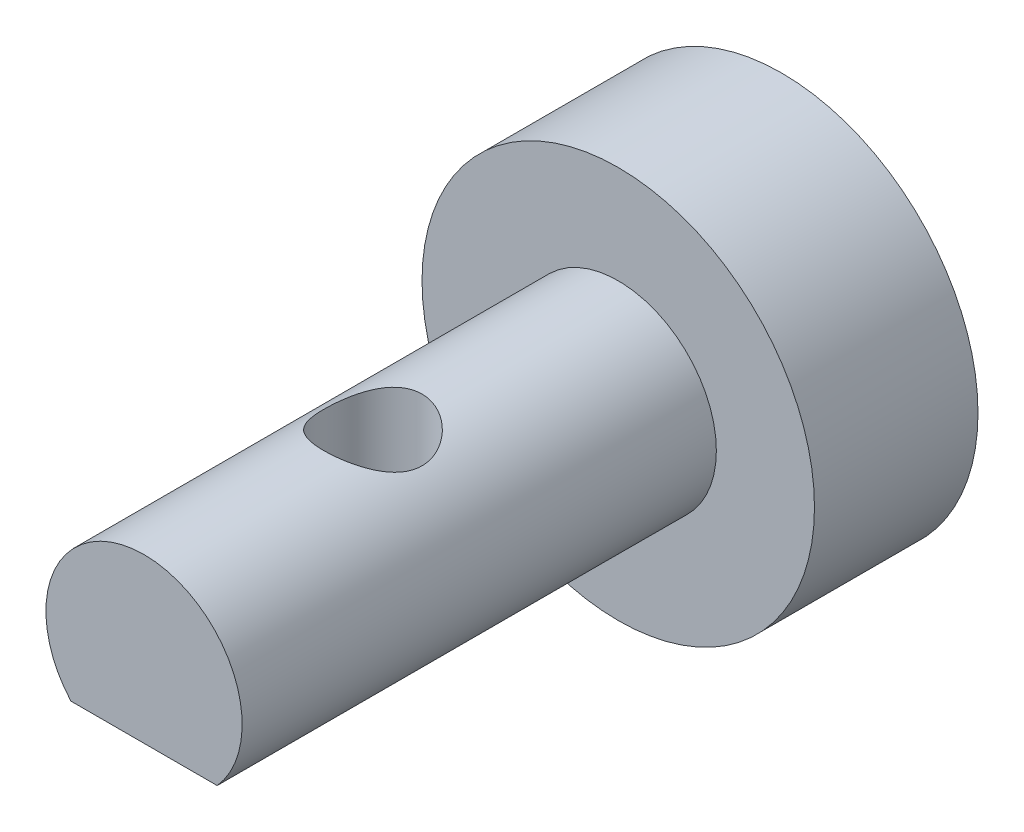
ISO-10303-21;
HEADER;
FILE_DESCRIPTION(('STEP AP214'),'2;1');
FILE_NAME('part.step','',(''),(''),'','','');
FILE_SCHEMA(('AUTOMOTIVE_DESIGN { 1 0 10303 214 1 1 1 1 }'));
ENDSEC;
DATA;
#1=APPLICATION_CONTEXT('core data for automotive mechanical design processes');
#2=APPLICATION_PROTOCOL_DEFINITION('international standard','automotive_design',2000,#1);
#3=PRODUCT_CONTEXT('',#1,'mechanical');
#4=PRODUCT('Part','Part','',(#3));
#5=PRODUCT_RELATED_PRODUCT_CATEGORY('part','',(#4));
#6=PRODUCT_DEFINITION_FORMATION('','',#4);
#7=PRODUCT_DEFINITION_CONTEXT('part definition',#1,'design');
#8=PRODUCT_DEFINITION('design','',#6,#7);
#9=PRODUCT_DEFINITION_SHAPE('','',#8);
#10=(LENGTH_UNIT() NAMED_UNIT(*) SI_UNIT(.MILLI.,.METRE.));
#11=(NAMED_UNIT(*) PLANE_ANGLE_UNIT() SI_UNIT($,.RADIAN.));
#12=(NAMED_UNIT(*) SI_UNIT($,.STERADIAN.) SOLID_ANGLE_UNIT());
#13=UNCERTAINTY_MEASURE_WITH_UNIT(LENGTH_MEASURE(1.E-05),#10,'distance_accuracy_value','');
#14=(GEOMETRIC_REPRESENTATION_CONTEXT(3) GLOBAL_UNCERTAINTY_ASSIGNED_CONTEXT((#13)) GLOBAL_UNIT_ASSIGNED_CONTEXT((#10,
#11,#12)) REPRESENTATION_CONTEXT('',''));
#15=CARTESIAN_POINT('',(0.,0.,0.));
#16=DIRECTION('',(0.,0.,1.));
#17=DIRECTION('',(1.,0.,0.));
#18=AXIS2_PLACEMENT_3D('',#15,#16,#17);
#19=CARTESIAN_POINT('',(0.,0.,5.));
#20=DIRECTION('',(0.,0.,-1.));
#21=DIRECTION('',(-1.,0.,0.));
#22=AXIS2_PLACEMENT_3D('',#19,#20,#21);
#23=CYLINDRICAL_SURFACE('',#22,6.);
#24=CARTESIAN_POINT('',(0.,0.,5.));
#25=DIRECTION('',(0.,0.,1.));
#26=DIRECTION('',(1.,0.,0.));
#27=AXIS2_PLACEMENT_3D('',#24,#25,#26);
#28=CIRCLE('',#27,6.);
#29=CARTESIAN_POINT('',(6.,0.,5.));
#30=VERTEX_POINT('',#29);
#31=EDGE_CURVE('E52',#30,#30,#28,.T.);
#32=ORIENTED_EDGE('',*,*,#31,.F.);
#33=EDGE_LOOP('',(#32));
#34=FACE_BOUND('',#33,.T.);
#35=CARTESIAN_POINT('',(0.,0.,0.));
#36=DIRECTION('',(0.,0.,1.));
#37=DIRECTION('',(1.,0.,0.));
#38=AXIS2_PLACEMENT_3D('',#35,#36,#37);
#39=CIRCLE('',#38,6.);
#40=CARTESIAN_POINT('',(6.,0.,0.));
#41=VERTEX_POINT('',#40);
#42=EDGE_CURVE('E47',#41,#41,#39,.T.);
#43=ORIENTED_EDGE('',*,*,#42,.T.);
#44=EDGE_LOOP('',(#43));
#45=FACE_BOUND('',#44,.T.);
#46=ADVANCED_FACE('F44',(#34,#45),#23,.T.);
#47=CARTESIAN_POINT('',(0.,0.,5.));
#48=DIRECTION('',(0.,0.,1.));
#49=DIRECTION('',(1.,0.,0.));
#50=AXIS2_PLACEMENT_3D('',#47,#48,#49);
#51=PLANE('',#50);
#52=CARTESIAN_POINT('',(0.,0.,5.));
#53=DIRECTION('',(0.,0.,1.));
#54=DIRECTION('',(1.,0.,0.));
#55=AXIS2_PLACEMENT_3D('',#52,#53,#54);
#56=CIRCLE('',#55,3.);
#57=CARTESIAN_POINT('',(3.,0.,5.));
#58=VERTEX_POINT('',#57);
#59=EDGE_CURVE('E13',#58,#58,#56,.T.);
#60=ORIENTED_EDGE('',*,*,#59,.F.);
#61=EDGE_LOOP('',(#60));
#62=FACE_BOUND('',#61,.T.);
#63=ORIENTED_EDGE('',*,*,#31,.T.);
#64=EDGE_LOOP('',(#63));
#65=FACE_BOUND('',#64,.T.);
#66=ADVANCED_FACE('F100',(#62,#65),#51,.T.);
#67=CARTESIAN_POINT('',(0.,0.,0.));
#68=DIRECTION('',(0.,0.,1.));
#69=DIRECTION('',(1.,0.,0.));
#70=AXIS2_PLACEMENT_3D('',#67,#68,#69);
#71=PLANE('',#70);
#72=ORIENTED_EDGE('',*,*,#42,.F.);
#73=EDGE_LOOP('',(#72));
#74=FACE_BOUND('',#73,.T.);
#75=ADVANCED_FACE('F98',(#74),#71,.F.);
#76=CARTESIAN_POINT('',(0.,0.,7.5));
#77=DIRECTION('',(0.,0.,-1.));
#78=DIRECTION('',(-1.,0.,0.));
#79=AXIS2_PLACEMENT_3D('',#76,#77,#78);
#80=CYLINDRICAL_SURFACE('',#79,3.);
#81=CARTESIAN_POINT('',(0.,3.,11.));
#82=CARTESIAN_POINT('',(-0.0788579444268493,2.99999570107562,11.0000049534758));
#83=CARTESIAN_POINT('',(-0.157809899546343,2.99685736529635,11.0062551096816));
#84=CARTESIAN_POINT('',(-0.313380352903343,2.98461234055736,11.0309793205123));
#85=CARTESIAN_POINT('',(-0.389994130070444,2.97549431743379,11.0494765894967));
#86=CARTESIAN_POINT('',(-0.538400317320673,2.95224419105063,11.0977907129249));
#87=CARTESIAN_POINT('',(-0.610210204408719,2.93813158766306,11.127563576372));
#88=CARTESIAN_POINT('',(-0.747708925209897,2.90618664773642,11.1973559320475));
#89=CARTESIAN_POINT('',(-0.813398240985088,2.88835460450288,11.2373746163733));
#90=CARTESIAN_POINT('',(-0.941261726642864,2.84934387387093,11.3292758742279));
#91=CARTESIAN_POINT('',(-1.00298281668316,2.82802798691306,11.3817297188595));
#92=CARTESIAN_POINT('',(-1.11716916730047,2.78489955370115,11.4957822188706));
#93=CARTESIAN_POINT('',(-1.16962737466015,2.76308664313552,11.5573877776587));
#94=CARTESIAN_POINT('',(-1.26787800067542,2.71948426796021,11.6937250242851));
#95=CARTESIAN_POINT('',(-1.31283800332745,2.69782780455198,11.7691041475189));
#96=CARTESIAN_POINT('',(-1.38925234033604,2.65928968158481,11.9275510039793));
#97=CARTESIAN_POINT('',(-1.4207163224495,2.64240461410484,12.0106131930841));
#98=CARTESIAN_POINT('',(-1.46719866328288,2.61686800556713,12.1769976581329));
#99=CARTESIAN_POINT('',(-1.48308878562066,2.6077840737557,12.2600066781011));
#100=CARTESIAN_POINT('',(-1.50064048996327,2.59772834922792,12.4279682566692));
#101=CARTESIAN_POINT('',(-1.50231613255961,2.59674854014932,12.5129188113067));
#102=CARTESIAN_POINT('',(-1.49203093075844,2.60266395385873,12.6714290364731));
#103=CARTESIAN_POINT('',(-1.48167683930523,2.6086314549302,12.7451360468346));
#104=CARTESIAN_POINT('',(-1.4504097735854,2.62614343100776,12.8895828640596));
#105=CARTESIAN_POINT('',(-1.42949343584648,2.63768968247664,12.960321717958));
#106=CARTESIAN_POINT('',(-1.37731467057901,2.66531214619112,13.0988436988485));
#107=CARTESIAN_POINT('',(-1.34582260067399,2.68148760995998,13.1665195981787));
#108=CARTESIAN_POINT('',(-1.273562531502,2.71655106422106,13.295951438885));
#109=CARTESIAN_POINT('',(-1.2327903657187,2.73544027170286,13.3577047034001));
#110=CARTESIAN_POINT('',(-1.13709908236918,2.77669736854929,13.4817818791148));
#111=CARTESIAN_POINT('',(-1.08104168755392,2.79920265355119,13.5431853103642));
#112=CARTESIAN_POINT('',(-0.95933336811206,2.84321434950611,13.6561031278864));
#113=CARTESIAN_POINT('',(-0.893677884861428,2.86472027938201,13.7076127880508));
#114=CARTESIAN_POINT('',(-0.750774758747773,2.90552980924446,13.8015284915446));
#115=CARTESIAN_POINT('',(-0.673130387399114,2.92468476243011,13.8434007086686));
#116=CARTESIAN_POINT('',(-0.510699323233195,2.95736821681863,13.9131455435645));
#117=CARTESIAN_POINT('',(-0.425918364397913,2.9709011841533,13.9410292775228));
#118=CARTESIAN_POINT('',(-0.259149737491052,2.98986500612153,13.979713105575));
#119=CARTESIAN_POINT('',(-0.177512295822488,2.99587407451965,13.9917368536202));
#120=CARTESIAN_POINT('',(-0.0131693999240266,3.00109520188655,14.0021970967017));
#121=CARTESIAN_POINT('',(0.0695355298048639,3.00031048081978,14.0006400284592));
#122=CARTESIAN_POINT('',(0.226849457978981,2.99236788380152,13.9846899673719));
#123=CARTESIAN_POINT('',(0.301589112074896,2.98570868532252,13.971301200905));
#124=CARTESIAN_POINT('',(0.447610338452912,2.9673325697226,13.9336428921573));
#125=CARTESIAN_POINT('',(0.518891528536631,2.95561509501618,13.9093721503198));
#126=CARTESIAN_POINT('',(0.65833291267436,2.92776377120382,13.8500023003505));
#127=CARTESIAN_POINT('',(0.726345595508706,2.91151322654446,13.8146134248256));
#128=CARTESIAN_POINT('',(0.855692042548908,2.87615961476126,13.7343386965302));
#129=CARTESIAN_POINT('',(0.917022944664888,2.85705533350407,13.6894487981069));
#130=CARTESIAN_POINT('',(1.03765153393382,2.81562332004297,13.5863593620039));
#131=CARTESIAN_POINT('',(1.09615811672854,2.79316327265249,13.5272856973323));
#132=CARTESIAN_POINT('',(1.20278448167828,2.7489358741323,13.4001122730834));
#133=CARTESIAN_POINT('',(1.25089707856781,2.72716901100071,13.3320063217281));
#134=CARTESIAN_POINT('',(1.33756187171853,2.68576788309734,13.1845345187405));
#135=CARTESIAN_POINT('',(1.37553824370037,2.66628794383591,13.1047831008583));
#136=CARTESIAN_POINT('',(1.43712423890206,2.63361108441202,12.9387348986376));
#137=CARTESIAN_POINT('',(1.46075237380053,2.62040607332625,12.8524467102997));
#138=CARTESIAN_POINT('',(1.49079253120031,2.60342251538703,12.6846346656729));
#139=CARTESIAN_POINT('',(1.49863949460818,2.59886075197597,12.6034486198471));
#140=CARTESIAN_POINT('',(1.5010337315643,2.59748031962405,12.4408293992532));
#141=CARTESIAN_POINT('',(1.49558676993486,2.60065829439585,12.3593963468932));
#142=CARTESIAN_POINT('',(1.47288918838997,2.61356793076615,12.2067747476998));
#143=CARTESIAN_POINT('',(1.45681247151455,2.62264641723988,12.1353492947829));
#144=CARTESIAN_POINT('',(1.41476303733662,2.64556524281479,11.9962878208635));
#145=CARTESIAN_POINT('',(1.38878713673988,2.65940711354503,11.928653026862));
#146=CARTESIAN_POINT('',(1.32572361795085,2.69142795546803,11.7940627235202));
#147=CARTESIAN_POINT('',(1.28800670672355,2.70983583593881,11.7274581472565));
#148=CARTESIAN_POINT('',(1.20322645745609,2.7485299745229,11.6010881957281));
#149=CARTESIAN_POINT('',(1.15615825686234,2.76881720693416,11.5413264042183));
#150=CARTESIAN_POINT('',(1.04730498999206,2.81193484737138,11.422787026468));
#151=CARTESIAN_POINT('',(0.984426634495895,2.83477474959942,11.3650113464746));
#152=CARTESIAN_POINT('',(0.849232209349798,2.87816628389896,11.2606055248471));
#153=CARTESIAN_POINT('',(0.776911084957798,2.89871667939293,11.2139813907951));
#154=CARTESIAN_POINT('',(0.623897395174421,2.93547014349806,11.1331454559319));
#155=CARTESIAN_POINT('',(0.543149255665099,2.95164144740899,11.0990237461453));
#156=CARTESIAN_POINT('',(0.376113151707133,2.9775201194848,11.0452877483639));
#157=CARTESIAN_POINT('',(0.289841699383653,2.98724585044602,11.0256322297914));
#158=CARTESIAN_POINT('',(0.168902919736345,2.99543192870217,11.0091538833714));
#159=CARTESIAN_POINT('',(0.135242819162349,2.99714048010376,11.0057260387005));
#160=CARTESIAN_POINT('',(0.0677275977076386,2.99942545465223,11.0011480017289));
#161=CARTESIAN_POINT('',(0.0338724714699437,3.00000184655071,10.9999978722947));
#162=CARTESIAN_POINT('',(0.,3.,11.));
#163=B_SPLINE_CURVE_WITH_KNOTS('',3,(#81,#82,#83,#84,#85,#86,#87,#88,#89,#90,#91,#92,#93,#94,
#95,#96,#97,#98,#99,#100,#101,#102,#103,#104,#105,#106,#107,#108,#109,#110,#111,#112,#113,#114,
#115,#116,#117,#118,#119,#120,#121,#122,#123,#124,#125,#126,#127,#128,#129,#130,#131,#132,#133,
#134,#135,#136,#137,#138,#139,#140,#141,#142,#143,#144,#145,#146,#147,#148,#149,#150,#151,#152,
#153,#154,#155,#156,#157,#158,#159,#160,#161,#162),.UNSPECIFIED.,.T.,.F.,(4,2,2,2,2,2,2,2,2,2,2,
2,2,2,2,2,2,2,2,2,2,2,2,2,2,2,2,2,2,2,2,2,2,2,2,2,2,2,2,2,4),(0.,0.236436386130439,
0.473322224563797,0.709293233238448,0.945245640872352,1.19547263807713,1.44588935648105,
1.71572589646129,1.98536921847421,2.23887018210344,2.49212035993531,2.71508568613981,
2.93812205888517,3.16635360252731,3.39468781890333,3.65197412000818,3.90938301898029,
4.17874533321661,4.44789325368419,4.69474935707018,4.94148846767214,5.16910359759183,
5.39674382446397,5.63089284041848,5.86514176122509,6.12239415966628,6.37982382923148,
6.64972023242588,6.91926767918176,7.1629396125457,7.40650589797017,7.62686895373283,
7.84730293182526,8.08254685170431,8.31791341715446,8.58187864135757,8.84598575071869,
9.1119602049529,9.37717362931724,9.47872920200875,9.58028757766599),.UNSPECIFIED.);
#164=CARTESIAN_POINT('',(0.,3.,11.));
#165=VERTEX_POINT('',#164);
#166=EDGE_CURVE('E84',#165,#165,#163,.T.);
#167=ORIENTED_EDGE('',*,*,#166,.F.);
#168=EDGE_LOOP('',(#167));
#169=FACE_BOUND('',#168,.T.);
#170=CARTESIAN_POINT('',(0.,0.,7.5));
#171=DIRECTION('',(0.,0.,1.));
#172=DIRECTION('',(1.,0.,0.));
#173=AXIS2_PLACEMENT_3D('',#170,#171,#172);
#174=CIRCLE('',#173,3.);
#175=CARTESIAN_POINT('',(-2.23606797749979,-2.,7.5));
#176=VERTEX_POINT('',#175);
#177=CARTESIAN_POINT('',(2.23606797749979,-2.,7.5));
#178=VERTEX_POINT('',#177);
#179=EDGE_CURVE('E71',#176,#178,#174,.T.);
#180=ORIENTED_EDGE('',*,*,#179,.F.);
#181=DIRECTION('',(0.,0.,-1.));
#182=VECTOR('',#181,1.);
#183=CARTESIAN_POINT('',(-2.23606797749979,-2.,19.5));
#184=LINE('',#183,#182);
#185=CARTESIAN_POINT('',(-2.23606797749979,-2.,19.5));
#186=VERTEX_POINT('',#185);
#187=EDGE_CURVE('E77',#186,#176,#184,.T.);
#188=ORIENTED_EDGE('',*,*,#187,.F.);
#189=CARTESIAN_POINT('',(0.,0.,19.5));
#190=DIRECTION('',(0.,0.,1.));
#191=DIRECTION('',(1.,0.,0.));
#192=AXIS2_PLACEMENT_3D('',#189,#190,#191);
#193=CIRCLE('',#192,3.);
#194=CARTESIAN_POINT('',(2.23606797749979,-2.,19.5));
#195=VERTEX_POINT('',#194);
#196=EDGE_CURVE('E83',#195,#186,#193,.T.);
#197=ORIENTED_EDGE('',*,*,#196,.F.);
#198=DIRECTION('',(0.,0.,-1.));
#199=VECTOR('',#198,1.);
#200=CARTESIAN_POINT('',(2.23606797749979,-2.,19.5));
#201=LINE('',#200,#199);
#202=EDGE_CURVE('E81',#195,#178,#201,.T.);
#203=ORIENTED_EDGE('',*,*,#202,.T.);
#204=EDGE_LOOP('',(#180,#188,#197,#203));
#205=FACE_BOUND('',#204,.T.);
#206=ORIENTED_EDGE('',*,*,#59,.T.);
#207=EDGE_LOOP('',(#206));
#208=FACE_BOUND('',#207,.T.);
#209=ADVANCED_FACE('F86',(#169,#205,#208),#80,.T.);
#210=CARTESIAN_POINT('',(0.,0.,7.5));
#211=DIRECTION('',(0.,0.,1.));
#212=DIRECTION('',(1.,0.,0.));
#213=AXIS2_PLACEMENT_3D('',#210,#211,#212);
#214=PLANE('',#213);
#215=DIRECTION('',(1.,0.,0.));
#216=VECTOR('',#215,1.);
#217=CARTESIAN_POINT('',(-2.23606797749979,-2.,7.5));
#218=LINE('',#217,#216);
#219=EDGE_CURVE('E59',#176,#178,#218,.T.);
#220=ORIENTED_EDGE('',*,*,#219,.F.);
#221=ORIENTED_EDGE('',*,*,#179,.T.);
#222=EDGE_LOOP('',(#220,#221));
#223=FACE_BOUND('',#222,.T.);
#224=ADVANCED_FACE('F72',(#223),#214,.T.);
#225=CARTESIAN_POINT('',(-2.23606797749979,-2.,19.5));
#226=DIRECTION('',(0.,1.,0.));
#227=DIRECTION('',(0.,0.,1.));
#228=AXIS2_PLACEMENT_3D('',#225,#226,#227);
#229=PLANE('',#228);
#230=CARTESIAN_POINT('',(0.,-2.,12.5));
#231=DIRECTION('',(0.,-1.,0.));
#232=DIRECTION('',(0.,0.,-1.));
#233=AXIS2_PLACEMENT_3D('',#230,#231,#232);
#234=CIRCLE('',#233,1.5);
#235=CARTESIAN_POINT('',(0.,-2.,11.));
#236=VERTEX_POINT('',#235);
#237=EDGE_CURVE('E178',#236,#236,#234,.T.);
#238=ORIENTED_EDGE('',*,*,#237,.F.);
#239=EDGE_LOOP('',(#238));
#240=FACE_BOUND('',#239,.T.);
#241=ORIENTED_EDGE('',*,*,#219,.T.);
#242=ORIENTED_EDGE('',*,*,#202,.F.);
#243=DIRECTION('',(1.,0.,0.));
#244=VECTOR('',#243,1.);
#245=CARTESIAN_POINT('',(-2.23606797749979,-2.,19.5));
#246=LINE('',#245,#244);
#247=EDGE_CURVE('E67',#186,#195,#246,.T.);
#248=ORIENTED_EDGE('',*,*,#247,.F.);
#249=ORIENTED_EDGE('',*,*,#187,.T.);
#250=EDGE_LOOP('',(#241,#242,#248,#249));
#251=FACE_BOUND('',#250,.T.);
#252=ADVANCED_FACE('F80',(#240,#251),#229,.F.);
#253=CARTESIAN_POINT('',(0.,0.,19.5));
#254=DIRECTION('',(0.,0.,1.));
#255=DIRECTION('',(1.,0.,0.));
#256=AXIS2_PLACEMENT_3D('',#253,#254,#255);
#257=PLANE('',#256);
#258=ORIENTED_EDGE('',*,*,#196,.T.);
#259=ORIENTED_EDGE('',*,*,#247,.T.);
#260=EDGE_LOOP('',(#258,#259));
#261=FACE_BOUND('',#260,.T.);
#262=ADVANCED_FACE('F135',(#261),#257,.T.);
#263=CARTESIAN_POINT('',(0.,6.001,12.5));
#264=DIRECTION('',(0.,-1.,0.));
#265=DIRECTION('',(0.,0.,-1.));
#266=AXIS2_PLACEMENT_3D('',#263,#264,#265);
#267=CYLINDRICAL_SURFACE('',#266,1.5);
#268=ORIENTED_EDGE('',*,*,#237,.T.);
#269=EDGE_LOOP('',(#268));
#270=FACE_BOUND('',#269,.T.);
#271=ORIENTED_EDGE('',*,*,#166,.T.);
#272=EDGE_LOOP('',(#271));
#273=FACE_BOUND('',#272,.T.);
#274=ADVANCED_FACE('F140',(#270,#273),#267,.F.);
#275=CLOSED_SHELL('',(#46,#66,#75,#209,#224,#252,#262,#274));
#276=MANIFOLD_SOLID_BREP('B2',#275);
#277=ADVANCED_BREP_SHAPE_REPRESENTATION('',(#18,#276),#14);
#278=SHAPE_DEFINITION_REPRESENTATION(#9,#277);
ENDSEC;
END-ISO-10303-21;
